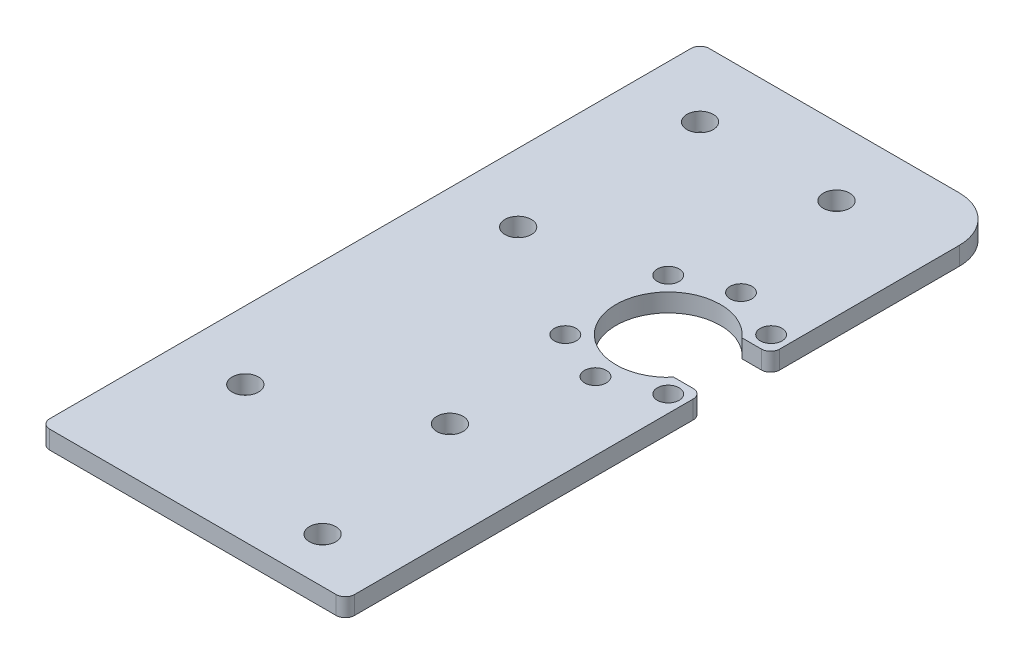
ISO-10303-21;
HEADER;
FILE_DESCRIPTION(('STEP AP214'),'2;1');
FILE_NAME('part.step','',(''),(''),'','','');
FILE_SCHEMA(('AUTOMOTIVE_DESIGN { 1 0 10303 214 1 1 1 1 }'));
ENDSEC;
DATA;
#1=APPLICATION_CONTEXT('core data for automotive mechanical design processes');
#2=APPLICATION_PROTOCOL_DEFINITION('international standard','automotive_design',2000,#1);
#3=PRODUCT_CONTEXT('',#1,'mechanical');
#4=PRODUCT('Part','Part','',(#3));
#5=PRODUCT_RELATED_PRODUCT_CATEGORY('part','',(#4));
#6=PRODUCT_DEFINITION_FORMATION('','',#4);
#7=PRODUCT_DEFINITION_CONTEXT('part definition',#1,'design');
#8=PRODUCT_DEFINITION('design','',#6,#7);
#9=PRODUCT_DEFINITION_SHAPE('','',#8);
#10=(LENGTH_UNIT() NAMED_UNIT(*) SI_UNIT(.MILLI.,.METRE.));
#11=(NAMED_UNIT(*) PLANE_ANGLE_UNIT() SI_UNIT($,.RADIAN.));
#12=(NAMED_UNIT(*) SI_UNIT($,.STERADIAN.) SOLID_ANGLE_UNIT());
#13=UNCERTAINTY_MEASURE_WITH_UNIT(LENGTH_MEASURE(1.E-05),#10,'distance_accuracy_value','');
#14=(GEOMETRIC_REPRESENTATION_CONTEXT(3) GLOBAL_UNCERTAINTY_ASSIGNED_CONTEXT((#13)) GLOBAL_UNIT_ASSIGNED_CONTEXT((#10,
#11,#12)) REPRESENTATION_CONTEXT('',''));
#15=CARTESIAN_POINT('',(0.,0.,0.));
#16=DIRECTION('',(0.,0.,1.));
#17=DIRECTION('',(1.,0.,0.));
#18=AXIS2_PLACEMENT_3D('',#15,#16,#17);
#19=CARTESIAN_POINT('',(67.,4.,0.));
#20=DIRECTION('',(-1.,0.,0.));
#21=DIRECTION('',(0.,0.,1.));
#22=AXIS2_PLACEMENT_3D('',#19,#20,#21);
#23=PLANE('',#22);
#24=DIRECTION('',(0.,0.,-1.));
#25=VECTOR('',#24,1.);
#26=CARTESIAN_POINT('',(67.,4.,0.));
#27=LINE('',#26,#25);
#28=CARTESIAN_POINT('',(67.,4.,-95.5000000000014));
#29=VERTEX_POINT('',#28);
#30=CARTESIAN_POINT('',(67.,4.,-135.));
#31=VERTEX_POINT('',#30);
#32=EDGE_CURVE('E183',#29,#31,#27,.T.);
#33=ORIENTED_EDGE('',*,*,#32,.F.);
#34=DIRECTION('',(0.,1.,0.));
#35=VECTOR('',#34,1.);
#36=CARTESIAN_POINT('',(67.,4.,-95.5000000000014));
#37=LINE('',#36,#35);
#38=CARTESIAN_POINT('',(67.,0.,-95.5000000000014));
#39=VERTEX_POINT('',#38);
#40=EDGE_CURVE('E236',#29,#39,#37,.F.);
#41=ORIENTED_EDGE('',*,*,#40,.T.);
#42=DIRECTION('',(0.,0.,-1.));
#43=VECTOR('',#42,1.);
#44=CARTESIAN_POINT('',(67.,0.,0.));
#45=LINE('',#44,#43);
#46=CARTESIAN_POINT('',(67.,0.,-135.));
#47=VERTEX_POINT('',#46);
#48=EDGE_CURVE('E194',#39,#47,#45,.T.);
#49=ORIENTED_EDGE('',*,*,#48,.T.);
#50=DIRECTION('',(0.,-1.,0.));
#51=VECTOR('',#50,1.);
#52=CARTESIAN_POINT('',(67.,4.,-135.));
#53=LINE('',#52,#51);
#54=EDGE_CURVE('E204',#47,#31,#53,.F.);
#55=ORIENTED_EDGE('',*,*,#54,.T.);
#56=EDGE_LOOP('',(#33,#41,#49,#55));
#57=FACE_BOUND('',#56,.T.);
#58=ADVANCED_FACE('F35',(#57),#23,.F.);
#59=CARTESIAN_POINT('',(0.,4.,0.));
#60=DIRECTION('',(1.,0.,0.));
#61=DIRECTION('',(0.,0.,-1.));
#62=AXIS2_PLACEMENT_3D('',#59,#60,#61);
#63=PLANE('',#62);
#64=DIRECTION('',(0.,0.,1.));
#65=VECTOR('',#64,1.);
#66=CARTESIAN_POINT('',(0.,4.,0.));
#67=LINE('',#66,#65);
#68=CARTESIAN_POINT('',(0.,4.,-143.));
#69=VERTEX_POINT('',#68);
#70=CARTESIAN_POINT('',(0.,4.,-2.));
#71=VERTEX_POINT('',#70);
#72=EDGE_CURVE('E176',#69,#71,#67,.T.);
#73=ORIENTED_EDGE('',*,*,#72,.F.);
#74=DIRECTION('',(0.,-1.,0.));
#75=VECTOR('',#74,1.);
#76=CARTESIAN_POINT('',(0.,4.,-143.));
#77=LINE('',#76,#75);
#78=CARTESIAN_POINT('',(0.,0.,-143.));
#79=VERTEX_POINT('',#78);
#80=EDGE_CURVE('E240',#69,#79,#77,.T.);
#81=ORIENTED_EDGE('',*,*,#80,.T.);
#82=DIRECTION('',(0.,0.,1.));
#83=VECTOR('',#82,1.);
#84=CARTESIAN_POINT('',(0.,0.,0.));
#85=LINE('',#84,#83);
#86=CARTESIAN_POINT('',(0.,0.,-2.));
#87=VERTEX_POINT('',#86);
#88=EDGE_CURVE('E174',#79,#87,#85,.T.);
#89=ORIENTED_EDGE('',*,*,#88,.T.);
#90=DIRECTION('',(0.,-1.,0.));
#91=VECTOR('',#90,1.);
#92=CARTESIAN_POINT('',(0.,4.,-2.));
#93=LINE('',#92,#91);
#94=EDGE_CURVE('E238',#87,#71,#93,.F.);
#95=ORIENTED_EDGE('',*,*,#94,.T.);
#96=EDGE_LOOP('',(#73,#81,#89,#95));
#97=FACE_BOUND('',#96,.T.);
#98=ADVANCED_FACE('F287',(#97),#63,.F.);
#99=CARTESIAN_POINT('',(0.,4.,0.));
#100=DIRECTION('',(0.,0.,-1.));
#101=DIRECTION('',(-1.,0.,0.));
#102=AXIS2_PLACEMENT_3D('',#99,#100,#101);
#103=PLANE('',#102);
#104=DIRECTION('',(1.,0.,0.));
#105=VECTOR('',#104,1.);
#106=CARTESIAN_POINT('',(0.,4.,0.));
#107=LINE('',#106,#105);
#108=CARTESIAN_POINT('',(2.,4.,0.));
#109=VERTEX_POINT('',#108);
#110=CARTESIAN_POINT('',(65.,4.,0.));
#111=VERTEX_POINT('',#110);
#112=EDGE_CURVE('E179',#109,#111,#107,.T.);
#113=ORIENTED_EDGE('',*,*,#112,.F.);
#114=DIRECTION('',(0.,-1.,0.));
#115=VECTOR('',#114,1.);
#116=CARTESIAN_POINT('',(2.,4.,0.));
#117=LINE('',#116,#115);
#118=CARTESIAN_POINT('',(2.,0.,0.));
#119=VERTEX_POINT('',#118);
#120=EDGE_CURVE('E11',#109,#119,#117,.T.);
#121=ORIENTED_EDGE('',*,*,#120,.T.);
#122=DIRECTION('',(1.,0.,0.));
#123=VECTOR('',#122,1.);
#124=CARTESIAN_POINT('',(0.,0.,0.));
#125=LINE('',#124,#123);
#126=CARTESIAN_POINT('',(65.,0.,0.));
#127=VERTEX_POINT('',#126);
#128=EDGE_CURVE('E191',#119,#127,#125,.T.);
#129=ORIENTED_EDGE('',*,*,#128,.T.);
#130=DIRECTION('',(0.,-1.,0.));
#131=VECTOR('',#130,1.);
#132=CARTESIAN_POINT('',(65.,4.,0.));
#133=LINE('',#132,#131);
#134=EDGE_CURVE('E43',#127,#111,#133,.F.);
#135=ORIENTED_EDGE('',*,*,#134,.T.);
#136=EDGE_LOOP('',(#113,#121,#129,#135));
#137=FACE_BOUND('',#136,.T.);
#138=ADVANCED_FACE('F246',(#137),#103,.F.);
#139=CARTESIAN_POINT('',(67.,0.,-2.));
#140=VERTEX_POINT('',#139);
#141=CARTESIAN_POINT('',(67.,0.,-76.5000000000014));
#142=VERTEX_POINT('',#141);
#143=EDGE_CURVE('E196',#140,#142,#45,.T.);
#144=ORIENTED_EDGE('',*,*,#143,.T.);
#145=DIRECTION('',(0.,1.,0.));
#146=VECTOR('',#145,1.);
#147=CARTESIAN_POINT('',(67.,4.,-76.5000000000014));
#148=LINE('',#147,#146);
#149=CARTESIAN_POINT('',(67.,4.,-76.5000000000014));
#150=VERTEX_POINT('',#149);
#151=EDGE_CURVE('E212',#142,#150,#148,.T.);
#152=ORIENTED_EDGE('',*,*,#151,.T.);
#153=CARTESIAN_POINT('',(67.,4.,-2.));
#154=VERTEX_POINT('',#153);
#155=EDGE_CURVE('E185',#154,#150,#27,.T.);
#156=ORIENTED_EDGE('',*,*,#155,.F.);
#157=DIRECTION('',(0.,-1.,0.));
#158=VECTOR('',#157,1.);
#159=CARTESIAN_POINT('',(67.,4.,-2.));
#160=LINE('',#159,#158);
#161=EDGE_CURVE('E209',#154,#140,#160,.T.);
#162=ORIENTED_EDGE('',*,*,#161,.T.);
#163=EDGE_LOOP('',(#144,#152,#156,#162));
#164=FACE_BOUND('',#163,.T.);
#165=ADVANCED_FACE('F259',(#164),#23,.F.);
#166=CARTESIAN_POINT('',(0.,4.,-145.));
#167=DIRECTION('',(0.,0.,1.));
#168=DIRECTION('',(1.,0.,0.));
#169=AXIS2_PLACEMENT_3D('',#166,#167,#168);
#170=PLANE('',#169);
#171=DIRECTION('',(-1.,0.,0.));
#172=VECTOR('',#171,1.);
#173=CARTESIAN_POINT('',(0.,0.,-145.));
#174=LINE('',#173,#172);
#175=CARTESIAN_POINT('',(57.,0.,-145.));
#176=VERTEX_POINT('',#175);
#177=CARTESIAN_POINT('',(2.,0.,-145.));
#178=VERTEX_POINT('',#177);
#179=EDGE_CURVE('E180',#176,#178,#174,.T.);
#180=ORIENTED_EDGE('',*,*,#179,.T.);
#181=DIRECTION('',(0.,-1.,0.));
#182=VECTOR('',#181,1.);
#183=CARTESIAN_POINT('',(2.,4.,-145.));
#184=LINE('',#183,#182);
#185=CARTESIAN_POINT('',(2.,4.,-145.));
#186=VERTEX_POINT('',#185);
#187=EDGE_CURVE('E242',#178,#186,#184,.F.);
#188=ORIENTED_EDGE('',*,*,#187,.T.);
#189=DIRECTION('',(-1.,0.,0.));
#190=VECTOR('',#189,1.);
#191=CARTESIAN_POINT('',(0.,4.,-145.));
#192=LINE('',#191,#190);
#193=CARTESIAN_POINT('',(57.,4.,-145.));
#194=VERTEX_POINT('',#193);
#195=EDGE_CURVE('E186',#194,#186,#192,.T.);
#196=ORIENTED_EDGE('',*,*,#195,.F.);
#197=DIRECTION('',(0.,-1.,0.));
#198=VECTOR('',#197,1.);
#199=CARTESIAN_POINT('',(57.,4.,-145.));
#200=LINE('',#199,#198);
#201=EDGE_CURVE('E189',#194,#176,#200,.T.);
#202=ORIENTED_EDGE('',*,*,#201,.T.);
#203=EDGE_LOOP('',(#180,#188,#196,#202));
#204=FACE_BOUND('',#203,.T.);
#205=ADVANCED_FACE('F297',(#204),#170,.F.);
#206=CARTESIAN_POINT('',(0.,4.,0.));
#207=DIRECTION('',(0.,-1.,0.));
#208=DIRECTION('',(0.,0.,-1.));
#209=AXIS2_PLACEMENT_3D('',#206,#207,#208);
#210=PLANE('',#209);
#211=CARTESIAN_POINT('',(45.,4.,-45.));
#212=DIRECTION('',(0.,1.,0.));
#213=DIRECTION('',(0.,0.,1.));
#214=AXIS2_PLACEMENT_3D('',#211,#212,#213);
#215=CIRCLE('',#214,2.9);
#216=CARTESIAN_POINT('',(45.,4.,-42.1));
#217=VERTEX_POINT('',#216);
#218=EDGE_CURVE('E607',#217,#217,#215,.T.);
#219=ORIENTED_EDGE('',*,*,#218,.F.);
#220=EDGE_LOOP('',(#219));
#221=FACE_BOUND('',#220,.T.);
#222=CARTESIAN_POINT('',(45.,4.,-130.));
#223=DIRECTION('',(0.,1.,0.));
#224=DIRECTION('',(0.,0.,1.));
#225=AXIS2_PLACEMENT_3D('',#222,#223,#224);
#226=CIRCLE('',#225,2.90000000000002);
#227=CARTESIAN_POINT('',(45.,4.,-127.1));
#228=VERTEX_POINT('',#227);
#229=EDGE_CURVE('E601',#228,#228,#226,.T.);
#230=ORIENTED_EDGE('',*,*,#229,.F.);
#231=EDGE_LOOP('',(#230));
#232=FACE_BOUND('',#231,.T.);
#233=CARTESIAN_POINT('',(15.,4.,-30.));
#234=DIRECTION('',(0.,1.,0.));
#235=DIRECTION('',(0.,0.,1.));
#236=AXIS2_PLACEMENT_3D('',#233,#234,#235);
#237=CIRCLE('',#236,2.9);
#238=CARTESIAN_POINT('',(15.,4.,-27.1));
#239=VERTEX_POINT('',#238);
#240=EDGE_CURVE('E595',#239,#239,#237,.T.);
#241=ORIENTED_EDGE('',*,*,#240,.F.);
#242=EDGE_LOOP('',(#241));
#243=FACE_BOUND('',#242,.T.);
#244=CARTESIAN_POINT('',(52.,4.,-10.));
#245=DIRECTION('',(0.,1.,0.));
#246=DIRECTION('',(0.,0.,1.));
#247=AXIS2_PLACEMENT_3D('',#244,#245,#246);
#248=CIRCLE('',#247,2.9);
#249=CARTESIAN_POINT('',(52.,4.,-7.1));
#250=VERTEX_POINT('',#249);
#251=EDGE_CURVE('E589',#250,#250,#248,.T.);
#252=ORIENTED_EDGE('',*,*,#251,.F.);
#253=EDGE_LOOP('',(#252));
#254=FACE_BOUND('',#253,.T.);
#255=CARTESIAN_POINT('',(15.,4.,-90.));
#256=DIRECTION('',(0.,1.,0.));
#257=DIRECTION('',(0.,0.,1.));
#258=AXIS2_PLACEMENT_3D('',#255,#256,#257);
#259=CIRCLE('',#258,2.90000000000001);
#260=CARTESIAN_POINT('',(15.,4.,-87.1));
#261=VERTEX_POINT('',#260);
#262=EDGE_CURVE('E583',#261,#261,#259,.T.);
#263=ORIENTED_EDGE('',*,*,#262,.F.);
#264=EDGE_LOOP('',(#263));
#265=FACE_BOUND('',#264,.T.);
#266=CARTESIAN_POINT('',(15.,4.,-130.));
#267=DIRECTION('',(0.,1.,0.));
#268=DIRECTION('',(0.,0.,1.));
#269=AXIS2_PLACEMENT_3D('',#266,#267,#268);
#270=CIRCLE('',#269,2.90000000000001);
#271=CARTESIAN_POINT('',(15.,4.,-127.1));
#272=VERTEX_POINT('',#271);
#273=EDGE_CURVE('E577',#272,#272,#270,.T.);
#274=ORIENTED_EDGE('',*,*,#273,.F.);
#275=EDGE_LOOP('',(#274));
#276=FACE_BOUND('',#275,.T.);
#277=CARTESIAN_POINT('',(63.3137085501789,4.,-97.3137085501804));
#278=DIRECTION('',(0.,1.,0.));
#279=DIRECTION('',(0.,0.,1.));
#280=AXIS2_PLACEMENT_3D('',#277,#278,#279);
#281=CIRCLE('',#280,2.4);
#282=CARTESIAN_POINT('',(63.3137085501789,4.,-94.9137085501804));
#283=VERTEX_POINT('',#282);
#284=EDGE_CURVE('E571',#283,#283,#281,.T.);
#285=ORIENTED_EDGE('',*,*,#284,.F.);
#286=EDGE_LOOP('',(#285));
#287=FACE_BOUND('',#286,.T.);
#288=CARTESIAN_POINT('',(52.,4.,-102.000000072401));
#289=DIRECTION('',(0.,1.,0.));
#290=DIRECTION('',(0.,0.,1.));
#291=AXIS2_PLACEMENT_3D('',#288,#289,#290);
#292=CIRCLE('',#291,2.39999999999999);
#293=CARTESIAN_POINT('',(52.,4.,-99.6000000724009));
#294=VERTEX_POINT('',#293);
#295=EDGE_CURVE('E565',#294,#294,#292,.T.);
#296=ORIENTED_EDGE('',*,*,#295,.F.);
#297=EDGE_LOOP('',(#296));
#298=FACE_BOUND('',#297,.T.);
#299=CARTESIAN_POINT('',(40.6862914498211,4.,-97.3137085501804));
#300=DIRECTION('',(0.,1.,0.));
#301=DIRECTION('',(0.,0.,1.));
#302=AXIS2_PLACEMENT_3D('',#299,#300,#301);
#303=CIRCLE('',#302,2.40000000000002);
#304=CARTESIAN_POINT('',(40.6862914498211,4.,-94.9137085501803));
#305=VERTEX_POINT('',#304);
#306=EDGE_CURVE('E559',#305,#305,#303,.T.);
#307=ORIENTED_EDGE('',*,*,#306,.F.);
#308=EDGE_LOOP('',(#307));
#309=FACE_BOUND('',#308,.T.);
#310=CARTESIAN_POINT('',(40.6862914498211,4.,-74.6862914498225));
#311=DIRECTION('',(0.,1.,0.));
#312=DIRECTION('',(0.,0.,1.));
#313=AXIS2_PLACEMENT_3D('',#310,#311,#312);
#314=CIRCLE('',#313,2.40000000000001);
#315=CARTESIAN_POINT('',(40.6862914498211,4.,-72.2862914498225));
#316=VERTEX_POINT('',#315);
#317=EDGE_CURVE('E553',#316,#316,#314,.T.);
#318=ORIENTED_EDGE('',*,*,#317,.F.);
#319=EDGE_LOOP('',(#318));
#320=FACE_BOUND('',#319,.T.);
#321=CARTESIAN_POINT('',(52.,4.,-69.9999999276019));
#322=DIRECTION('',(0.,1.,0.));
#323=DIRECTION('',(0.,0.,1.));
#324=AXIS2_PLACEMENT_3D('',#321,#322,#323);
#325=CIRCLE('',#324,2.4);
#326=CARTESIAN_POINT('',(52.,4.,-67.5999999276019));
#327=VERTEX_POINT('',#326);
#328=EDGE_CURVE('E547',#327,#327,#325,.T.);
#329=ORIENTED_EDGE('',*,*,#328,.F.);
#330=EDGE_LOOP('',(#329));
#331=FACE_BOUND('',#330,.T.);
#332=CARTESIAN_POINT('',(63.3137085501789,4.,-74.6862914498225));
#333=DIRECTION('',(0.,1.,0.));
#334=DIRECTION('',(0.,0.,1.));
#335=AXIS2_PLACEMENT_3D('',#332,#333,#334);
#336=CIRCLE('',#335,2.4);
#337=CARTESIAN_POINT('',(63.3137085501789,4.,-72.2862914498225));
#338=VERTEX_POINT('',#337);
#339=EDGE_CURVE('E542',#338,#338,#336,.T.);
#340=ORIENTED_EDGE('',*,*,#339,.F.);
#341=EDGE_LOOP('',(#340));
#342=FACE_BOUND('',#341,.T.);
#343=ORIENTED_EDGE('',*,*,#155,.T.);
#344=CARTESIAN_POINT('',(65.,4.,-76.5000000000014));
#345=DIRECTION('',(0.,-1.,0.));
#346=DIRECTION('',(0.,0.,-1.));
#347=AXIS2_PLACEMENT_3D('',#344,#345,#346);
#348=CIRCLE('',#347,2.);
#349=CARTESIAN_POINT('',(65.,4.,-78.5000000000014));
#350=VERTEX_POINT('',#349);
#351=EDGE_CURVE('E223',#150,#350,#348,.F.);
#352=ORIENTED_EDGE('',*,*,#351,.T.);
#353=DIRECTION('',(1.,0.,0.));
#354=VECTOR('',#353,1.);
#355=CARTESIAN_POINT('',(0.,4.,-78.5000000000014));
#356=LINE('',#355,#354);
#357=CARTESIAN_POINT('',(60.7177978870813,4.,-78.5000000000014));
#358=VERTEX_POINT('',#357);
#359=EDGE_CURVE('E149',#358,#350,#356,.T.);
#360=ORIENTED_EDGE('',*,*,#359,.F.);
#361=CARTESIAN_POINT('',(52.,4.,-86.0000000000014));
#362=DIRECTION('',(0.,1.,0.));
#363=DIRECTION('',(0.,0.,1.));
#364=AXIS2_PLACEMENT_3D('',#361,#362,#363);
#365=CIRCLE('',#364,11.5);
#366=CARTESIAN_POINT('',(60.7177978870813,4.,-93.5000000000014));
#367=VERTEX_POINT('',#366);
#368=EDGE_CURVE('E169',#367,#358,#365,.T.);
#369=ORIENTED_EDGE('',*,*,#368,.F.);
#370=DIRECTION('',(-1.,0.,0.));
#371=VECTOR('',#370,1.);
#372=CARTESIAN_POINT('',(0.,4.,-93.5000000000014));
#373=LINE('',#372,#371);
#374=CARTESIAN_POINT('',(65.,4.,-93.5000000000014));
#375=VERTEX_POINT('',#374);
#376=EDGE_CURVE('E155',#375,#367,#373,.T.);
#377=ORIENTED_EDGE('',*,*,#376,.F.);
#378=CARTESIAN_POINT('',(65.,4.,-95.5000000000014));
#379=DIRECTION('',(0.,-1.,0.));
#380=DIRECTION('',(0.,0.,-1.));
#381=AXIS2_PLACEMENT_3D('',#378,#379,#380);
#382=CIRCLE('',#381,2.);
#383=EDGE_CURVE('E221',#375,#29,#382,.F.);
#384=ORIENTED_EDGE('',*,*,#383,.T.);
#385=ORIENTED_EDGE('',*,*,#32,.T.);
#386=CARTESIAN_POINT('',(57.,4.,-135.));
#387=DIRECTION('',(0.,-1.,0.));
#388=DIRECTION('',(0.,0.,-1.));
#389=AXIS2_PLACEMENT_3D('',#386,#387,#388);
#390=CIRCLE('',#389,10.);
#391=EDGE_CURVE('E207',#31,#194,#390,.F.);
#392=ORIENTED_EDGE('',*,*,#391,.T.);
#393=ORIENTED_EDGE('',*,*,#195,.T.);
#394=CARTESIAN_POINT('',(2.,4.,-143.));
#395=DIRECTION('',(0.,-1.,0.));
#396=DIRECTION('',(0.,0.,-1.));
#397=AXIS2_PLACEMENT_3D('',#394,#395,#396);
#398=CIRCLE('',#397,2.);
#399=EDGE_CURVE('E219',#186,#69,#398,.F.);
#400=ORIENTED_EDGE('',*,*,#399,.T.);
#401=ORIENTED_EDGE('',*,*,#72,.T.);
#402=CARTESIAN_POINT('',(2.,4.,-2.));
#403=DIRECTION('',(0.,-1.,0.));
#404=DIRECTION('',(0.,0.,-1.));
#405=AXIS2_PLACEMENT_3D('',#402,#403,#404);
#406=CIRCLE('',#405,2.);
#407=EDGE_CURVE('E217',#71,#109,#406,.F.);
#408=ORIENTED_EDGE('',*,*,#407,.T.);
#409=ORIENTED_EDGE('',*,*,#112,.T.);
#410=CARTESIAN_POINT('',(65.,4.,-2.));
#411=DIRECTION('',(0.,-1.,0.));
#412=DIRECTION('',(0.,0.,-1.));
#413=AXIS2_PLACEMENT_3D('',#410,#411,#412);
#414=CIRCLE('',#413,2.);
#415=EDGE_CURVE('E215',#111,#154,#414,.F.);
#416=ORIENTED_EDGE('',*,*,#415,.T.);
#417=EDGE_LOOP('',(#343,#352,#360,#369,#377,#384,#385,#392,#393,#400,#401,#408,#409,#416));
#418=FACE_BOUND('',#417,.T.);
#419=ADVANCED_FACE('F252',(#221,#232,#243,#254,#265,#276,#287,#298,#309,#320,#331,#342,#418),
#210,.F.);
#420=CARTESIAN_POINT('',(0.,0.,0.));
#421=DIRECTION('',(0.,-1.,0.));
#422=DIRECTION('',(0.,0.,-1.));
#423=AXIS2_PLACEMENT_3D('',#420,#421,#422);
#424=PLANE('',#423);
#425=CARTESIAN_POINT('',(45.,0.,-45.));
#426=DIRECTION('',(0.,1.,0.));
#427=DIRECTION('',(0.,0.,1.));
#428=AXIS2_PLACEMENT_3D('',#425,#426,#427);
#429=CIRCLE('',#428,2.9);
#430=CARTESIAN_POINT('',(45.,0.,-42.1));
#431=VERTEX_POINT('',#430);
#432=EDGE_CURVE('E604',#431,#431,#429,.T.);
#433=ORIENTED_EDGE('',*,*,#432,.T.);
#434=EDGE_LOOP('',(#433));
#435=FACE_BOUND('',#434,.T.);
#436=CARTESIAN_POINT('',(45.,0.,-130.));
#437=DIRECTION('',(0.,1.,0.));
#438=DIRECTION('',(0.,0.,1.));
#439=AXIS2_PLACEMENT_3D('',#436,#437,#438);
#440=CIRCLE('',#439,2.90000000000002);
#441=CARTESIAN_POINT('',(45.,0.,-127.1));
#442=VERTEX_POINT('',#441);
#443=EDGE_CURVE('E598',#442,#442,#440,.T.);
#444=ORIENTED_EDGE('',*,*,#443,.T.);
#445=EDGE_LOOP('',(#444));
#446=FACE_BOUND('',#445,.T.);
#447=CARTESIAN_POINT('',(15.,0.,-30.));
#448=DIRECTION('',(0.,1.,0.));
#449=DIRECTION('',(0.,0.,1.));
#450=AXIS2_PLACEMENT_3D('',#447,#448,#449);
#451=CIRCLE('',#450,2.9);
#452=CARTESIAN_POINT('',(15.,0.,-27.1));
#453=VERTEX_POINT('',#452);
#454=EDGE_CURVE('E592',#453,#453,#451,.T.);
#455=ORIENTED_EDGE('',*,*,#454,.T.);
#456=EDGE_LOOP('',(#455));
#457=FACE_BOUND('',#456,.T.);
#458=CARTESIAN_POINT('',(52.,0.,-10.));
#459=DIRECTION('',(0.,1.,0.));
#460=DIRECTION('',(0.,0.,1.));
#461=AXIS2_PLACEMENT_3D('',#458,#459,#460);
#462=CIRCLE('',#461,2.9);
#463=CARTESIAN_POINT('',(52.,0.,-7.1));
#464=VERTEX_POINT('',#463);
#465=EDGE_CURVE('E586',#464,#464,#462,.T.);
#466=ORIENTED_EDGE('',*,*,#465,.T.);
#467=EDGE_LOOP('',(#466));
#468=FACE_BOUND('',#467,.T.);
#469=CARTESIAN_POINT('',(15.,0.,-90.));
#470=DIRECTION('',(0.,1.,0.));
#471=DIRECTION('',(0.,0.,1.));
#472=AXIS2_PLACEMENT_3D('',#469,#470,#471);
#473=CIRCLE('',#472,2.90000000000001);
#474=CARTESIAN_POINT('',(15.,0.,-87.1));
#475=VERTEX_POINT('',#474);
#476=EDGE_CURVE('E580',#475,#475,#473,.T.);
#477=ORIENTED_EDGE('',*,*,#476,.T.);
#478=EDGE_LOOP('',(#477));
#479=FACE_BOUND('',#478,.T.);
#480=CARTESIAN_POINT('',(15.,0.,-130.));
#481=DIRECTION('',(0.,1.,0.));
#482=DIRECTION('',(0.,0.,1.));
#483=AXIS2_PLACEMENT_3D('',#480,#481,#482);
#484=CIRCLE('',#483,2.90000000000001);
#485=CARTESIAN_POINT('',(15.,0.,-127.1));
#486=VERTEX_POINT('',#485);
#487=EDGE_CURVE('E574',#486,#486,#484,.T.);
#488=ORIENTED_EDGE('',*,*,#487,.T.);
#489=EDGE_LOOP('',(#488));
#490=FACE_BOUND('',#489,.T.);
#491=CARTESIAN_POINT('',(63.3137085501789,0.,-97.3137085501804));
#492=DIRECTION('',(0.,1.,0.));
#493=DIRECTION('',(0.,0.,1.));
#494=AXIS2_PLACEMENT_3D('',#491,#492,#493);
#495=CIRCLE('',#494,2.4);
#496=CARTESIAN_POINT('',(63.3137085501789,0.,-94.9137085501804));
#497=VERTEX_POINT('',#496);
#498=EDGE_CURVE('E568',#497,#497,#495,.T.);
#499=ORIENTED_EDGE('',*,*,#498,.T.);
#500=EDGE_LOOP('',(#499));
#501=FACE_BOUND('',#500,.T.);
#502=CARTESIAN_POINT('',(52.,0.,-102.000000072401));
#503=DIRECTION('',(0.,1.,0.));
#504=DIRECTION('',(0.,0.,1.));
#505=AXIS2_PLACEMENT_3D('',#502,#503,#504);
#506=CIRCLE('',#505,2.39999999999999);
#507=CARTESIAN_POINT('',(52.,0.,-99.6000000724009));
#508=VERTEX_POINT('',#507);
#509=EDGE_CURVE('E562',#508,#508,#506,.T.);
#510=ORIENTED_EDGE('',*,*,#509,.T.);
#511=EDGE_LOOP('',(#510));
#512=FACE_BOUND('',#511,.T.);
#513=CARTESIAN_POINT('',(40.6862914498211,0.,-97.3137085501804));
#514=DIRECTION('',(0.,1.,0.));
#515=DIRECTION('',(0.,0.,1.));
#516=AXIS2_PLACEMENT_3D('',#513,#514,#515);
#517=CIRCLE('',#516,2.40000000000002);
#518=CARTESIAN_POINT('',(40.6862914498211,0.,-94.9137085501803));
#519=VERTEX_POINT('',#518);
#520=EDGE_CURVE('E556',#519,#519,#517,.T.);
#521=ORIENTED_EDGE('',*,*,#520,.T.);
#522=EDGE_LOOP('',(#521));
#523=FACE_BOUND('',#522,.T.);
#524=CARTESIAN_POINT('',(40.6862914498211,0.,-74.6862914498225));
#525=DIRECTION('',(0.,1.,0.));
#526=DIRECTION('',(0.,0.,1.));
#527=AXIS2_PLACEMENT_3D('',#524,#525,#526);
#528=CIRCLE('',#527,2.40000000000001);
#529=CARTESIAN_POINT('',(40.6862914498211,0.,-72.2862914498225));
#530=VERTEX_POINT('',#529);
#531=EDGE_CURVE('E551',#530,#530,#528,.T.);
#532=ORIENTED_EDGE('',*,*,#531,.T.);
#533=EDGE_LOOP('',(#532));
#534=FACE_BOUND('',#533,.T.);
#535=CARTESIAN_POINT('',(52.,0.,-69.9999999276019));
#536=DIRECTION('',(0.,1.,0.));
#537=DIRECTION('',(0.,0.,1.));
#538=AXIS2_PLACEMENT_3D('',#535,#536,#537);
#539=CIRCLE('',#538,2.4);
#540=CARTESIAN_POINT('',(52.,0.,-67.5999999276019));
#541=VERTEX_POINT('',#540);
#542=EDGE_CURVE('E544',#541,#541,#539,.T.);
#543=ORIENTED_EDGE('',*,*,#542,.T.);
#544=EDGE_LOOP('',(#543));
#545=FACE_BOUND('',#544,.T.);
#546=CARTESIAN_POINT('',(63.3137085501789,0.,-74.6862914498225));
#547=DIRECTION('',(0.,1.,0.));
#548=DIRECTION('',(0.,0.,1.));
#549=AXIS2_PLACEMENT_3D('',#546,#547,#548);
#550=CIRCLE('',#549,2.4);
#551=CARTESIAN_POINT('',(63.3137085501789,0.,-72.2862914498225));
#552=VERTEX_POINT('',#551);
#553=EDGE_CURVE('E170',#552,#552,#550,.T.);
#554=ORIENTED_EDGE('',*,*,#553,.T.);
#555=EDGE_LOOP('',(#554));
#556=FACE_BOUND('',#555,.T.);
#557=DIRECTION('',(1.,0.,0.));
#558=VECTOR('',#557,1.);
#559=CARTESIAN_POINT('',(0.,0.,-78.5000000000014));
#560=LINE('',#559,#558);
#561=CARTESIAN_POINT('',(60.7177978870813,0.,-78.5000000000015));
#562=VERTEX_POINT('',#561);
#563=CARTESIAN_POINT('',(65.,0.,-78.5000000000014));
#564=VERTEX_POINT('',#563);
#565=EDGE_CURVE('E160',#562,#564,#560,.T.);
#566=ORIENTED_EDGE('',*,*,#565,.T.);
#567=CARTESIAN_POINT('',(65.,0.,-76.5000000000014));
#568=DIRECTION('',(0.,-1.,0.));
#569=DIRECTION('',(0.,0.,-1.));
#570=AXIS2_PLACEMENT_3D('',#567,#568,#569);
#571=CIRCLE('',#570,2.);
#572=EDGE_CURVE('E232',#564,#142,#571,.T.);
#573=ORIENTED_EDGE('',*,*,#572,.T.);
#574=ORIENTED_EDGE('',*,*,#143,.F.);
#575=CARTESIAN_POINT('',(65.,0.,-2.));
#576=DIRECTION('',(0.,-1.,0.));
#577=DIRECTION('',(0.,0.,-1.));
#578=AXIS2_PLACEMENT_3D('',#575,#576,#577);
#579=CIRCLE('',#578,2.);
#580=EDGE_CURVE('E227',#140,#127,#579,.T.);
#581=ORIENTED_EDGE('',*,*,#580,.T.);
#582=ORIENTED_EDGE('',*,*,#128,.F.);
#583=CARTESIAN_POINT('',(2.,0.,-2.));
#584=DIRECTION('',(0.,-1.,0.));
#585=DIRECTION('',(0.,0.,-1.));
#586=AXIS2_PLACEMENT_3D('',#583,#584,#585);
#587=CIRCLE('',#586,2.);
#588=EDGE_CURVE('E50',#119,#87,#587,.T.);
#589=ORIENTED_EDGE('',*,*,#588,.T.);
#590=ORIENTED_EDGE('',*,*,#88,.F.);
#591=CARTESIAN_POINT('',(2.,0.,-143.));
#592=DIRECTION('',(0.,-1.,0.));
#593=DIRECTION('',(0.,0.,-1.));
#594=AXIS2_PLACEMENT_3D('',#591,#592,#593);
#595=CIRCLE('',#594,2.);
#596=EDGE_CURVE('E58',#79,#178,#595,.T.);
#597=ORIENTED_EDGE('',*,*,#596,.T.);
#598=ORIENTED_EDGE('',*,*,#179,.F.);
#599=CARTESIAN_POINT('',(57.,0.,-135.));
#600=DIRECTION('',(0.,-1.,0.));
#601=DIRECTION('',(0.,0.,-1.));
#602=AXIS2_PLACEMENT_3D('',#599,#600,#601);
#603=CIRCLE('',#602,10.);
#604=EDGE_CURVE('E201',#176,#47,#603,.T.);
#605=ORIENTED_EDGE('',*,*,#604,.T.);
#606=ORIENTED_EDGE('',*,*,#48,.F.);
#607=CARTESIAN_POINT('',(65.,0.,-95.5000000000014));
#608=DIRECTION('',(0.,-1.,0.));
#609=DIRECTION('',(0.,0.,-1.));
#610=AXIS2_PLACEMENT_3D('',#607,#608,#609);
#611=CIRCLE('',#610,2.);
#612=CARTESIAN_POINT('',(65.,0.,-93.5000000000014));
#613=VERTEX_POINT('',#612);
#614=EDGE_CURVE('E145',#39,#613,#611,.T.);
#615=ORIENTED_EDGE('',*,*,#614,.T.);
#616=DIRECTION('',(-1.,0.,0.));
#617=VECTOR('',#616,1.);
#618=CARTESIAN_POINT('',(0.,0.,-93.5000000000014));
#619=LINE('',#618,#617);
#620=CARTESIAN_POINT('',(60.7177978870813,0.,-93.5000000000014));
#621=VERTEX_POINT('',#620);
#622=EDGE_CURVE('E137',#613,#621,#619,.T.);
#623=ORIENTED_EDGE('',*,*,#622,.T.);
#624=CARTESIAN_POINT('',(52.,0.,-86.0000000000014));
#625=DIRECTION('',(0.,1.,0.));
#626=DIRECTION('',(0.,0.,1.));
#627=AXIS2_PLACEMENT_3D('',#624,#625,#626);
#628=CIRCLE('',#627,11.5);
#629=EDGE_CURVE('E142',#621,#562,#628,.T.);
#630=ORIENTED_EDGE('',*,*,#629,.T.);
#631=EDGE_LOOP('',(#566,#573,#574,#581,#582,#589,#590,#597,#598,#605,#606,#615,#623,#630));
#632=FACE_BOUND('',#631,.T.);
#633=ADVANCED_FACE('F140',(#435,#446,#457,#468,#479,#490,#501,#512,#523,#534,#545,#556,#632),
#424,.T.);
#634=CARTESIAN_POINT('',(0.,0.,-93.5000000000014));
#635=DIRECTION('',(0.,0.,-1.));
#636=DIRECTION('',(-1.,0.,0.));
#637=AXIS2_PLACEMENT_3D('',#634,#635,#636);
#638=PLANE('',#637);
#639=ORIENTED_EDGE('',*,*,#622,.F.);
#640=DIRECTION('',(0.,1.,0.));
#641=VECTOR('',#640,1.);
#642=CARTESIAN_POINT('',(65.,0.,-93.5000000000014));
#643=LINE('',#642,#641);
#644=EDGE_CURVE('E234',#613,#375,#643,.T.);
#645=ORIENTED_EDGE('',*,*,#644,.T.);
#646=ORIENTED_EDGE('',*,*,#376,.T.);
#647=DIRECTION('',(0.,1.,0.));
#648=VECTOR('',#647,1.);
#649=CARTESIAN_POINT('',(60.7177978870813,0.,-93.5000000000014));
#650=LINE('',#649,#648);
#651=EDGE_CURVE('E152',#621,#367,#650,.T.);
#652=ORIENTED_EDGE('',*,*,#651,.F.);
#653=EDGE_LOOP('',(#639,#645,#646,#652));
#654=FACE_BOUND('',#653,.T.);
#655=ADVANCED_FACE('F153',(#654),#638,.F.);
#656=CARTESIAN_POINT('',(0.,0.,-78.5000000000014));
#657=DIRECTION('',(0.,0.,1.));
#658=DIRECTION('',(1.,0.,0.));
#659=AXIS2_PLACEMENT_3D('',#656,#657,#658);
#660=PLANE('',#659);
#661=ORIENTED_EDGE('',*,*,#359,.T.);
#662=DIRECTION('',(0.,1.,0.));
#663=VECTOR('',#662,1.);
#664=CARTESIAN_POINT('',(65.,0.,-78.5000000000014));
#665=LINE('',#664,#663);
#666=EDGE_CURVE('E225',#350,#564,#665,.F.);
#667=ORIENTED_EDGE('',*,*,#666,.T.);
#668=ORIENTED_EDGE('',*,*,#565,.F.);
#669=DIRECTION('',(0.,1.,0.));
#670=VECTOR('',#669,1.);
#671=CARTESIAN_POINT('',(60.7177978870813,0.,-78.5000000000014));
#672=LINE('',#671,#670);
#673=EDGE_CURVE('E159',#562,#358,#672,.T.);
#674=ORIENTED_EDGE('',*,*,#673,.T.);
#675=EDGE_LOOP('',(#661,#667,#668,#674));
#676=FACE_BOUND('',#675,.T.);
#677=ADVANCED_FACE('F267',(#676),#660,.F.);
#678=CARTESIAN_POINT('',(52.,0.,-86.0000000000014));
#679=DIRECTION('',(0.,1.,0.));
#680=DIRECTION('',(0.,0.,1.));
#681=AXIS2_PLACEMENT_3D('',#678,#679,#680);
#682=CYLINDRICAL_SURFACE('',#681,11.5);
#683=ORIENTED_EDGE('',*,*,#368,.T.);
#684=ORIENTED_EDGE('',*,*,#673,.F.);
#685=ORIENTED_EDGE('',*,*,#629,.F.);
#686=ORIENTED_EDGE('',*,*,#651,.T.);
#687=EDGE_LOOP('',(#683,#684,#685,#686));
#688=FACE_BOUND('',#687,.T.);
#689=ADVANCED_FACE('F163',(#688),#682,.F.);
#690=CARTESIAN_POINT('',(63.3137085501789,0.,-74.6862914498225));
#691=DIRECTION('',(0.,1.,0.));
#692=DIRECTION('',(0.,0.,1.));
#693=AXIS2_PLACEMENT_3D('',#690,#691,#692);
#694=CYLINDRICAL_SURFACE('',#693,2.4);
#695=ORIENTED_EDGE('',*,*,#553,.F.);
#696=EDGE_LOOP('',(#695));
#697=FACE_BOUND('',#696,.T.);
#698=ORIENTED_EDGE('',*,*,#339,.T.);
#699=EDGE_LOOP('',(#698));
#700=FACE_BOUND('',#699,.T.);
#701=ADVANCED_FACE('F517',(#697,#700),#694,.F.);
#702=CARTESIAN_POINT('',(52.,0.,-69.9999999276019));
#703=DIRECTION('',(0.,1.,0.));
#704=DIRECTION('',(0.,0.,1.));
#705=AXIS2_PLACEMENT_3D('',#702,#703,#704);
#706=CYLINDRICAL_SURFACE('',#705,2.4);
#707=ORIENTED_EDGE('',*,*,#542,.F.);
#708=EDGE_LOOP('',(#707));
#709=FACE_BOUND('',#708,.T.);
#710=ORIENTED_EDGE('',*,*,#328,.T.);
#711=EDGE_LOOP('',(#710));
#712=FACE_BOUND('',#711,.T.);
#713=ADVANCED_FACE('F507',(#709,#712),#706,.F.);
#714=CARTESIAN_POINT('',(40.6862914498211,0.,-74.6862914498225));
#715=DIRECTION('',(0.,1.,0.));
#716=DIRECTION('',(0.,0.,1.));
#717=AXIS2_PLACEMENT_3D('',#714,#715,#716);
#718=CYLINDRICAL_SURFACE('',#717,2.40000000000001);
#719=ORIENTED_EDGE('',*,*,#531,.F.);
#720=EDGE_LOOP('',(#719));
#721=FACE_BOUND('',#720,.T.);
#722=ORIENTED_EDGE('',*,*,#317,.T.);
#723=EDGE_LOOP('',(#722));
#724=FACE_BOUND('',#723,.T.);
#725=ADVANCED_FACE('F497',(#721,#724),#718,.F.);
#726=CARTESIAN_POINT('',(40.6862914498211,0.,-97.3137085501804));
#727=DIRECTION('',(0.,1.,0.));
#728=DIRECTION('',(0.,0.,1.));
#729=AXIS2_PLACEMENT_3D('',#726,#727,#728);
#730=CYLINDRICAL_SURFACE('',#729,2.40000000000002);
#731=ORIENTED_EDGE('',*,*,#520,.F.);
#732=EDGE_LOOP('',(#731));
#733=FACE_BOUND('',#732,.T.);
#734=ORIENTED_EDGE('',*,*,#306,.T.);
#735=EDGE_LOOP('',(#734));
#736=FACE_BOUND('',#735,.T.);
#737=ADVANCED_FACE('F487',(#733,#736),#730,.F.);
#738=CARTESIAN_POINT('',(52.,0.,-102.000000072401));
#739=DIRECTION('',(0.,1.,0.));
#740=DIRECTION('',(0.,0.,1.));
#741=AXIS2_PLACEMENT_3D('',#738,#739,#740);
#742=CYLINDRICAL_SURFACE('',#741,2.39999999999999);
#743=ORIENTED_EDGE('',*,*,#509,.F.);
#744=EDGE_LOOP('',(#743));
#745=FACE_BOUND('',#744,.T.);
#746=ORIENTED_EDGE('',*,*,#295,.T.);
#747=EDGE_LOOP('',(#746));
#748=FACE_BOUND('',#747,.T.);
#749=ADVANCED_FACE('F477',(#745,#748),#742,.F.);
#750=CARTESIAN_POINT('',(63.3137085501789,0.,-97.3137085501804));
#751=DIRECTION('',(0.,1.,0.));
#752=DIRECTION('',(0.,0.,1.));
#753=AXIS2_PLACEMENT_3D('',#750,#751,#752);
#754=CYLINDRICAL_SURFACE('',#753,2.4);
#755=ORIENTED_EDGE('',*,*,#498,.F.);
#756=EDGE_LOOP('',(#755));
#757=FACE_BOUND('',#756,.T.);
#758=ORIENTED_EDGE('',*,*,#284,.T.);
#759=EDGE_LOOP('',(#758));
#760=FACE_BOUND('',#759,.T.);
#761=ADVANCED_FACE('F467',(#757,#760),#754,.F.);
#762=CARTESIAN_POINT('',(15.,0.,-130.));
#763=DIRECTION('',(0.,1.,0.));
#764=DIRECTION('',(0.,0.,1.));
#765=AXIS2_PLACEMENT_3D('',#762,#763,#764);
#766=CYLINDRICAL_SURFACE('',#765,2.90000000000001);
#767=ORIENTED_EDGE('',*,*,#487,.F.);
#768=EDGE_LOOP('',(#767));
#769=FACE_BOUND('',#768,.T.);
#770=ORIENTED_EDGE('',*,*,#273,.T.);
#771=EDGE_LOOP('',(#770));
#772=FACE_BOUND('',#771,.T.);
#773=ADVANCED_FACE('F457',(#769,#772),#766,.F.);
#774=CARTESIAN_POINT('',(15.,0.,-90.));
#775=DIRECTION('',(0.,1.,0.));
#776=DIRECTION('',(0.,0.,1.));
#777=AXIS2_PLACEMENT_3D('',#774,#775,#776);
#778=CYLINDRICAL_SURFACE('',#777,2.90000000000001);
#779=ORIENTED_EDGE('',*,*,#476,.F.);
#780=EDGE_LOOP('',(#779));
#781=FACE_BOUND('',#780,.T.);
#782=ORIENTED_EDGE('',*,*,#262,.T.);
#783=EDGE_LOOP('',(#782));
#784=FACE_BOUND('',#783,.T.);
#785=ADVANCED_FACE('F447',(#781,#784),#778,.F.);
#786=CARTESIAN_POINT('',(52.,0.,-10.));
#787=DIRECTION('',(0.,1.,0.));
#788=DIRECTION('',(0.,0.,1.));
#789=AXIS2_PLACEMENT_3D('',#786,#787,#788);
#790=CYLINDRICAL_SURFACE('',#789,2.9);
#791=ORIENTED_EDGE('',*,*,#465,.F.);
#792=EDGE_LOOP('',(#791));
#793=FACE_BOUND('',#792,.T.);
#794=ORIENTED_EDGE('',*,*,#251,.T.);
#795=EDGE_LOOP('',(#794));
#796=FACE_BOUND('',#795,.T.);
#797=ADVANCED_FACE('F437',(#793,#796),#790,.F.);
#798=CARTESIAN_POINT('',(15.,0.,-30.));
#799=DIRECTION('',(0.,1.,0.));
#800=DIRECTION('',(0.,0.,1.));
#801=AXIS2_PLACEMENT_3D('',#798,#799,#800);
#802=CYLINDRICAL_SURFACE('',#801,2.9);
#803=ORIENTED_EDGE('',*,*,#454,.F.);
#804=EDGE_LOOP('',(#803));
#805=FACE_BOUND('',#804,.T.);
#806=ORIENTED_EDGE('',*,*,#240,.T.);
#807=EDGE_LOOP('',(#806));
#808=FACE_BOUND('',#807,.T.);
#809=ADVANCED_FACE('F427',(#805,#808),#802,.F.);
#810=CARTESIAN_POINT('',(45.,0.,-130.));
#811=DIRECTION('',(0.,1.,0.));
#812=DIRECTION('',(0.,0.,1.));
#813=AXIS2_PLACEMENT_3D('',#810,#811,#812);
#814=CYLINDRICAL_SURFACE('',#813,2.90000000000002);
#815=ORIENTED_EDGE('',*,*,#443,.F.);
#816=EDGE_LOOP('',(#815));
#817=FACE_BOUND('',#816,.T.);
#818=ORIENTED_EDGE('',*,*,#229,.T.);
#819=EDGE_LOOP('',(#818));
#820=FACE_BOUND('',#819,.T.);
#821=ADVANCED_FACE('F312',(#817,#820),#814,.F.);
#822=CARTESIAN_POINT('',(45.,0.,-45.));
#823=DIRECTION('',(0.,1.,0.));
#824=DIRECTION('',(0.,0.,1.));
#825=AXIS2_PLACEMENT_3D('',#822,#823,#824);
#826=CYLINDRICAL_SURFACE('',#825,2.9);
#827=ORIENTED_EDGE('',*,*,#432,.F.);
#828=EDGE_LOOP('',(#827));
#829=FACE_BOUND('',#828,.T.);
#830=ORIENTED_EDGE('',*,*,#218,.T.);
#831=EDGE_LOOP('',(#830));
#832=FACE_BOUND('',#831,.T.);
#833=ADVANCED_FACE('F307',(#829,#832),#826,.F.);
#834=CARTESIAN_POINT('',(57.,4.,-135.));
#835=DIRECTION('',(0.,-1.,0.));
#836=DIRECTION('',(0.,0.,-1.));
#837=AXIS2_PLACEMENT_3D('',#834,#835,#836);
#838=CYLINDRICAL_SURFACE('',#837,10.);
#839=ORIENTED_EDGE('',*,*,#391,.F.);
#840=ORIENTED_EDGE('',*,*,#54,.F.);
#841=ORIENTED_EDGE('',*,*,#604,.F.);
#842=ORIENTED_EDGE('',*,*,#201,.F.);
#843=EDGE_LOOP('',(#839,#840,#841,#842));
#844=FACE_BOUND('',#843,.T.);
#845=ADVANCED_FACE('F284',(#844),#838,.T.);
#846=CARTESIAN_POINT('',(65.,4.,-76.5000000000014));
#847=DIRECTION('',(0.,1.,0.));
#848=DIRECTION('',(0.,0.,1.));
#849=AXIS2_PLACEMENT_3D('',#846,#847,#848);
#850=CYLINDRICAL_SURFACE('',#849,2.);
#851=ORIENTED_EDGE('',*,*,#572,.F.);
#852=ORIENTED_EDGE('',*,*,#666,.F.);
#853=ORIENTED_EDGE('',*,*,#351,.F.);
#854=ORIENTED_EDGE('',*,*,#151,.F.);
#855=EDGE_LOOP('',(#851,#852,#853,#854));
#856=FACE_BOUND('',#855,.T.);
#857=ADVANCED_FACE('F264',(#856),#850,.T.);
#858=CARTESIAN_POINT('',(65.,0.,-95.5000000000014));
#859=DIRECTION('',(0.,1.,0.));
#860=DIRECTION('',(0.,0.,1.));
#861=AXIS2_PLACEMENT_3D('',#858,#859,#860);
#862=CYLINDRICAL_SURFACE('',#861,2.);
#863=ORIENTED_EDGE('',*,*,#614,.F.);
#864=ORIENTED_EDGE('',*,*,#40,.F.);
#865=ORIENTED_EDGE('',*,*,#383,.F.);
#866=ORIENTED_EDGE('',*,*,#644,.F.);
#867=EDGE_LOOP('',(#863,#864,#865,#866));
#868=FACE_BOUND('',#867,.T.);
#869=ADVANCED_FACE('F274',(#868),#862,.T.);
#870=CARTESIAN_POINT('',(2.,4.,-143.));
#871=DIRECTION('',(0.,-1.,0.));
#872=DIRECTION('',(0.,0.,-1.));
#873=AXIS2_PLACEMENT_3D('',#870,#871,#872);
#874=CYLINDRICAL_SURFACE('',#873,2.);
#875=ORIENTED_EDGE('',*,*,#399,.F.);
#876=ORIENTED_EDGE('',*,*,#187,.F.);
#877=ORIENTED_EDGE('',*,*,#596,.F.);
#878=ORIENTED_EDGE('',*,*,#80,.F.);
#879=EDGE_LOOP('',(#875,#876,#877,#878));
#880=FACE_BOUND('',#879,.T.);
#881=ADVANCED_FACE('F276',(#880),#874,.T.);
#882=CARTESIAN_POINT('',(2.,4.,-2.));
#883=DIRECTION('',(0.,-1.,0.));
#884=DIRECTION('',(0.,0.,-1.));
#885=AXIS2_PLACEMENT_3D('',#882,#883,#884);
#886=CYLINDRICAL_SURFACE('',#885,2.);
#887=ORIENTED_EDGE('',*,*,#407,.F.);
#888=ORIENTED_EDGE('',*,*,#94,.F.);
#889=ORIENTED_EDGE('',*,*,#588,.F.);
#890=ORIENTED_EDGE('',*,*,#120,.F.);
#891=EDGE_LOOP('',(#887,#888,#889,#890));
#892=FACE_BOUND('',#891,.T.);
#893=ADVANCED_FACE('F282',(#892),#886,.T.);
#894=CARTESIAN_POINT('',(65.,4.,-2.));
#895=DIRECTION('',(0.,-1.,0.));
#896=DIRECTION('',(0.,0.,-1.));
#897=AXIS2_PLACEMENT_3D('',#894,#895,#896);
#898=CYLINDRICAL_SURFACE('',#897,2.);
#899=ORIENTED_EDGE('',*,*,#415,.F.);
#900=ORIENTED_EDGE('',*,*,#134,.F.);
#901=ORIENTED_EDGE('',*,*,#580,.F.);
#902=ORIENTED_EDGE('',*,*,#161,.F.);
#903=EDGE_LOOP('',(#899,#900,#901,#902));
#904=FACE_BOUND('',#903,.T.);
#905=ADVANCED_FACE('F37',(#904),#898,.T.);
#906=CLOSED_SHELL('',(#58,#98,#138,#165,#205,#419,#633,#655,#677,#689,#701,#713,#725,#737,#749,
#761,#773,#785,#797,#809,#821,#833,#845,#857,#869,#881,#893,#905));
#907=MANIFOLD_SOLID_BREP('B2',#906);
#908=ADVANCED_BREP_SHAPE_REPRESENTATION('',(#18,#907),#14);
#909=SHAPE_DEFINITION_REPRESENTATION(#9,#908);
ENDSEC;
END-ISO-10303-21;
